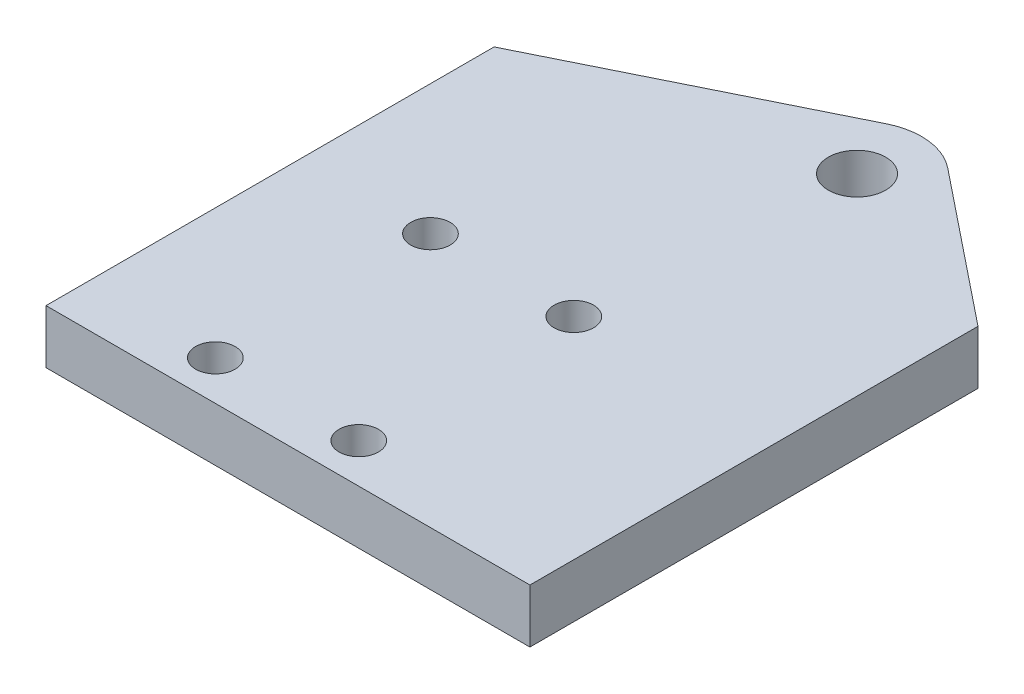
ISO-10303-21;
HEADER;
FILE_DESCRIPTION(('STEP AP214'),'2;1');
FILE_NAME('part.step','',(''),(''),'','','');
FILE_SCHEMA(('AUTOMOTIVE_DESIGN { 1 0 10303 214 1 1 1 1 }'));
ENDSEC;
DATA;
#1=APPLICATION_CONTEXT('core data for automotive mechanical design processes');
#2=APPLICATION_PROTOCOL_DEFINITION('international standard','automotive_design',2000,#1);
#3=PRODUCT_CONTEXT('',#1,'mechanical');
#4=PRODUCT('Part','Part','',(#3));
#5=PRODUCT_RELATED_PRODUCT_CATEGORY('part','',(#4));
#6=PRODUCT_DEFINITION_FORMATION('','',#4);
#7=PRODUCT_DEFINITION_CONTEXT('part definition',#1,'design');
#8=PRODUCT_DEFINITION('design','',#6,#7);
#9=PRODUCT_DEFINITION_SHAPE('','',#8);
#10=(LENGTH_UNIT() NAMED_UNIT(*) SI_UNIT(.MILLI.,.METRE.));
#11=(NAMED_UNIT(*) PLANE_ANGLE_UNIT() SI_UNIT($,.RADIAN.));
#12=(NAMED_UNIT(*) SI_UNIT($,.STERADIAN.) SOLID_ANGLE_UNIT());
#13=UNCERTAINTY_MEASURE_WITH_UNIT(LENGTH_MEASURE(1.E-05),#10,'distance_accuracy_value','');
#14=(GEOMETRIC_REPRESENTATION_CONTEXT(3) GLOBAL_UNCERTAINTY_ASSIGNED_CONTEXT((#13)) GLOBAL_UNIT_ASSIGNED_CONTEXT((#10,
#11,#12)) REPRESENTATION_CONTEXT('',''));
#15=CARTESIAN_POINT('',(0.,0.,0.));
#16=DIRECTION('',(0.,0.,1.));
#17=DIRECTION('',(1.,0.,0.));
#18=AXIS2_PLACEMENT_3D('',#15,#16,#17);
#19=CARTESIAN_POINT('',(16.25,0.,-29.));
#20=DIRECTION('',(0.,1.,0.));
#21=DIRECTION('',(0.,0.,1.));
#22=AXIS2_PLACEMENT_3D('',#19,#20,#21);
#23=PLANE('',#22);
#24=CARTESIAN_POINT('',(7.25,0.,-2.20000000000001));
#25=DIRECTION('',(0.,1.,0.));
#26=DIRECTION('',(0.,0.,-1.));
#27=AXIS2_PLACEMENT_3D('',#24,#25,#26);
#28=CIRCLE('',#27,1.1);
#29=CARTESIAN_POINT('',(7.25,0.,-3.30000000000001));
#30=VERTEX_POINT('',#29);
#31=EDGE_CURVE('E137',#30,#30,#28,.T.);
#32=ORIENTED_EDGE('',*,*,#31,.T.);
#33=EDGE_LOOP('',(#32));
#34=FACE_BOUND('',#33,.T.);
#35=CARTESIAN_POINT('',(15.25,0.,-2.2));
#36=DIRECTION('',(0.,1.,0.));
#37=DIRECTION('',(0.,0.,1.));
#38=AXIS2_PLACEMENT_3D('',#35,#36,#37);
#39=CIRCLE('',#38,1.1);
#40=CARTESIAN_POINT('',(15.25,0.,-1.1));
#41=VERTEX_POINT('',#40);
#42=EDGE_CURVE('E146',#41,#41,#39,.T.);
#43=ORIENTED_EDGE('',*,*,#42,.T.);
#44=EDGE_LOOP('',(#43));
#45=FACE_BOUND('',#44,.T.);
#46=CARTESIAN_POINT('',(15.25,0.,-14.2));
#47=DIRECTION('',(0.,1.,0.));
#48=DIRECTION('',(0.,0.,-1.));
#49=AXIS2_PLACEMENT_3D('',#46,#47,#48);
#50=CIRCLE('',#49,1.1);
#51=CARTESIAN_POINT('',(15.25,0.,-15.3));
#52=VERTEX_POINT('',#51);
#53=EDGE_CURVE('E152',#52,#52,#50,.T.);
#54=ORIENTED_EDGE('',*,*,#53,.T.);
#55=EDGE_LOOP('',(#54));
#56=FACE_BOUND('',#55,.T.);
#57=CARTESIAN_POINT('',(7.25,0.,-14.2));
#58=DIRECTION('',(0.,1.,0.));
#59=DIRECTION('',(0.,0.,1.));
#60=AXIS2_PLACEMENT_3D('',#57,#58,#59);
#61=CIRCLE('',#60,1.1);
#62=CARTESIAN_POINT('',(7.25,0.,-13.1));
#63=VERTEX_POINT('',#62);
#64=EDGE_CURVE('E158',#63,#63,#61,.T.);
#65=ORIENTED_EDGE('',*,*,#64,.T.);
#66=EDGE_LOOP('',(#65));
#67=FACE_BOUND('',#66,.T.);
#68=DIRECTION('',(0.,0.,1.));
#69=VECTOR('',#68,1.);
#70=CARTESIAN_POINT('',(19.7440573676193,0.,-18.));
#71=LINE('',#70,#69);
#72=CARTESIAN_POINT('',(19.7440573676193,0.,-30.8135033834861));
#73=VERTEX_POINT('',#72);
#74=CARTESIAN_POINT('',(19.7440573676193,0.,-18.));
#75=VERTEX_POINT('',#74);
#76=EDGE_CURVE('E131',#73,#75,#71,.T.);
#77=ORIENTED_EDGE('',*,*,#76,.F.);
#78=DIRECTION('',(-0.780409562277586,0.,-0.625268674335846));
#79=VECTOR('',#78,1.);
#80=CARTESIAN_POINT('',(27.,0.,-25.));
#81=LINE('',#80,#79);
#82=CARTESIAN_POINT('',(27.,0.,-25.));
#83=VERTEX_POINT('',#82);
#84=EDGE_CURVE('E188',#83,#73,#81,.T.);
#85=ORIENTED_EDGE('',*,*,#84,.F.);
#86=DIRECTION('',(0.,0.,-1.));
#87=VECTOR('',#86,1.);
#88=CARTESIAN_POINT('',(27.,0.,0.));
#89=LINE('',#88,#87);
#90=CARTESIAN_POINT('',(27.,0.,0.));
#91=VERTEX_POINT('',#90);
#92=EDGE_CURVE('E186',#91,#83,#89,.T.);
#93=ORIENTED_EDGE('',*,*,#92,.F.);
#94=DIRECTION('',(1.,0.,0.));
#95=VECTOR('',#94,1.);
#96=CARTESIAN_POINT('',(0.,0.,0.));
#97=LINE('',#96,#95);
#98=CARTESIAN_POINT('',(0.,0.,0.));
#99=VERTEX_POINT('',#98);
#100=EDGE_CURVE('E184',#99,#91,#97,.T.);
#101=ORIENTED_EDGE('',*,*,#100,.F.);
#102=DIRECTION('',(0.,0.,1.));
#103=VECTOR('',#102,1.);
#104=CARTESIAN_POINT('',(0.,0.,0.));
#105=LINE('',#104,#103);
#106=CARTESIAN_POINT('',(0.,0.,-25.));
#107=VERTEX_POINT('',#106);
#108=EDGE_CURVE('E164',#107,#99,#105,.T.);
#109=ORIENTED_EDGE('',*,*,#108,.F.);
#110=DIRECTION('',(-0.896864629431628,0.,0.442305139552401));
#111=VECTOR('',#110,1.);
#112=CARTESIAN_POINT('',(0.,0.,-25.));
#113=LINE('',#112,#111);
#114=CARTESIAN_POINT('',(1.74405736761932,0.,-25.8601136805463));
#115=VERTEX_POINT('',#114);
#116=EDGE_CURVE('E171',#115,#107,#113,.T.);
#117=ORIENTED_EDGE('',*,*,#116,.F.);
#118=DIRECTION('',(0.,0.,-1.));
#119=VECTOR('',#118,1.);
#120=CARTESIAN_POINT('',(1.74405736761932,0.,-25.8601136805463));
#121=LINE('',#120,#119);
#122=CARTESIAN_POINT('',(1.74405736761932,0.,-18.));
#123=VERTEX_POINT('',#122);
#124=EDGE_CURVE('E55',#123,#115,#121,.T.);
#125=ORIENTED_EDGE('',*,*,#124,.F.);
#126=DIRECTION('',(-1.,0.,0.));
#127=VECTOR('',#126,1.);
#128=CARTESIAN_POINT('',(1.74405736761932,0.,-18.));
#129=LINE('',#128,#127);
#130=EDGE_CURVE('E50',#75,#123,#129,.T.);
#131=ORIENTED_EDGE('',*,*,#130,.F.);
#132=EDGE_LOOP('',(#77,#85,#93,#101,#109,#117,#125,#131));
#133=FACE_BOUND('',#132,.T.);
#134=ADVANCED_FACE('F35',(#34,#45,#56,#67,#133),#23,.F.);
#135=CARTESIAN_POINT('',(16.25,3.,-29.));
#136=DIRECTION('',(0.,1.,0.));
#137=DIRECTION('',(0.,0.,1.));
#138=AXIS2_PLACEMENT_3D('',#135,#136,#137);
#139=PLANE('',#138);
#140=CARTESIAN_POINT('',(7.25,3.,-2.20000000000001));
#141=DIRECTION('',(0.,1.,0.));
#142=DIRECTION('',(0.,0.,-1.));
#143=AXIS2_PLACEMENT_3D('',#140,#141,#142);
#144=CIRCLE('',#143,1.1);
#145=CARTESIAN_POINT('',(7.25,3.,-3.30000000000001));
#146=VERTEX_POINT('',#145);
#147=EDGE_CURVE('E143',#146,#146,#144,.T.);
#148=ORIENTED_EDGE('',*,*,#147,.F.);
#149=EDGE_LOOP('',(#148));
#150=FACE_BOUND('',#149,.T.);
#151=CARTESIAN_POINT('',(15.25,3.,-14.2));
#152=DIRECTION('',(0.,1.,0.));
#153=DIRECTION('',(0.,0.,-1.));
#154=AXIS2_PLACEMENT_3D('',#151,#152,#153);
#155=CIRCLE('',#154,1.1);
#156=CARTESIAN_POINT('',(15.25,3.,-15.3));
#157=VERTEX_POINT('',#156);
#158=EDGE_CURVE('E155',#157,#157,#155,.T.);
#159=ORIENTED_EDGE('',*,*,#158,.F.);
#160=EDGE_LOOP('',(#159));
#161=FACE_BOUND('',#160,.T.);
#162=DIRECTION('',(0.,0.,1.));
#163=VECTOR('',#162,1.);
#164=CARTESIAN_POINT('',(0.,3.,0.));
#165=LINE('',#164,#163);
#166=CARTESIAN_POINT('',(0.,3.,-25.));
#167=VERTEX_POINT('',#166);
#168=CARTESIAN_POINT('',(0.,3.,0.));
#169=VERTEX_POINT('',#168);
#170=EDGE_CURVE('E167',#167,#169,#165,.T.);
#171=ORIENTED_EDGE('',*,*,#170,.T.);
#172=DIRECTION('',(1.,0.,0.));
#173=VECTOR('',#172,1.);
#174=CARTESIAN_POINT('',(0.,3.,0.));
#175=LINE('',#174,#173);
#176=CARTESIAN_POINT('',(27.,3.,0.));
#177=VERTEX_POINT('',#176);
#178=EDGE_CURVE('E170',#169,#177,#175,.T.);
#179=ORIENTED_EDGE('',*,*,#178,.T.);
#180=DIRECTION('',(0.,0.,-1.));
#181=VECTOR('',#180,1.);
#182=CARTESIAN_POINT('',(27.,3.,0.));
#183=LINE('',#182,#181);
#184=CARTESIAN_POINT('',(27.,3.,-25.));
#185=VERTEX_POINT('',#184);
#186=EDGE_CURVE('E173',#177,#185,#183,.T.);
#187=ORIENTED_EDGE('',*,*,#186,.T.);
#188=DIRECTION('',(-0.780409562277586,0.,-0.625268674335846));
#189=VECTOR('',#188,1.);
#190=CARTESIAN_POINT('',(27.,3.,-25.));
#191=LINE('',#190,#189);
#192=CARTESIAN_POINT('',(18.500967227609,3.,-31.8094744241993));
#193=VERTEX_POINT('',#192);
#194=EDGE_CURVE('E175',#185,#193,#191,.T.);
#195=ORIENTED_EDGE('',*,*,#194,.T.);
#196=CARTESIAN_POINT('',(16.25,3.,-29.));
#197=DIRECTION('',(0.,1.,0.));
#198=DIRECTION('',(0.,0.,1.));
#199=AXIS2_PLACEMENT_3D('',#196,#197,#198);
#200=CIRCLE('',#199,3.6);
#201=CARTESIAN_POINT('',(14.6577014976114,3.,-32.2287126659539));
#202=VERTEX_POINT('',#201);
#203=EDGE_CURVE('E177',#193,#202,#200,.T.);
#204=ORIENTED_EDGE('',*,*,#203,.T.);
#205=DIRECTION('',(-0.896864629431628,0.,0.442305139552401));
#206=VECTOR('',#205,1.);
#207=CARTESIAN_POINT('',(0.,3.,-25.));
#208=LINE('',#207,#206);
#209=EDGE_CURVE('E179',#202,#167,#208,.T.);
#210=ORIENTED_EDGE('',*,*,#209,.T.);
#211=EDGE_LOOP('',(#171,#179,#187,#195,#204,#210));
#212=FACE_BOUND('',#211,.T.);
#213=CARTESIAN_POINT('',(7.25,3.,-14.2));
#214=DIRECTION('',(0.,1.,0.));
#215=DIRECTION('',(0.,0.,1.));
#216=AXIS2_PLACEMENT_3D('',#213,#214,#215);
#217=CIRCLE('',#216,1.1);
#218=CARTESIAN_POINT('',(7.25,3.,-13.1));
#219=VERTEX_POINT('',#218);
#220=EDGE_CURVE('E161',#219,#219,#217,.T.);
#221=ORIENTED_EDGE('',*,*,#220,.F.);
#222=EDGE_LOOP('',(#221));
#223=FACE_BOUND('',#222,.T.);
#224=CARTESIAN_POINT('',(15.25,3.,-2.2));
#225=DIRECTION('',(0.,1.,0.));
#226=DIRECTION('',(0.,0.,1.));
#227=AXIS2_PLACEMENT_3D('',#224,#225,#226);
#228=CIRCLE('',#227,1.1);
#229=CARTESIAN_POINT('',(15.25,3.,-1.1));
#230=VERTEX_POINT('',#229);
#231=EDGE_CURVE('E149',#230,#230,#228,.T.);
#232=ORIENTED_EDGE('',*,*,#231,.F.);
#233=EDGE_LOOP('',(#232));
#234=FACE_BOUND('',#233,.T.);
#235=CARTESIAN_POINT('',(16.25,3.,-29.));
#236=DIRECTION('',(0.,1.,0.));
#237=DIRECTION('',(0.,0.,1.));
#238=AXIS2_PLACEMENT_3D('',#235,#236,#237);
#239=CIRCLE('',#238,1.6);
#240=CARTESIAN_POINT('',(16.25,3.,-27.4));
#241=VERTEX_POINT('',#240);
#242=EDGE_CURVE('E134',#241,#241,#239,.T.);
#243=ORIENTED_EDGE('',*,*,#242,.F.);
#244=EDGE_LOOP('',(#243));
#245=FACE_BOUND('',#244,.T.);
#246=ADVANCED_FACE('F248',(#150,#161,#212,#223,#234,#245),#139,.T.);
#247=CARTESIAN_POINT('',(0.,3.,0.));
#248=DIRECTION('',(1.,0.,0.));
#249=DIRECTION('',(0.,0.,-1.));
#250=AXIS2_PLACEMENT_3D('',#247,#248,#249);
#251=PLANE('',#250);
#252=ORIENTED_EDGE('',*,*,#108,.T.);
#253=DIRECTION('',(0.,-1.,0.));
#254=VECTOR('',#253,1.);
#255=CARTESIAN_POINT('',(0.,3.,0.));
#256=LINE('',#255,#254);
#257=EDGE_CURVE('E11',#169,#99,#256,.T.);
#258=ORIENTED_EDGE('',*,*,#257,.F.);
#259=ORIENTED_EDGE('',*,*,#170,.F.);
#260=DIRECTION('',(0.,-1.,0.));
#261=VECTOR('',#260,1.);
#262=CARTESIAN_POINT('',(0.,3.,-25.));
#263=LINE('',#262,#261);
#264=EDGE_CURVE('E181',#167,#107,#263,.T.);
#265=ORIENTED_EDGE('',*,*,#264,.T.);
#266=EDGE_LOOP('',(#252,#258,#259,#265));
#267=FACE_BOUND('',#266,.T.);
#268=ADVANCED_FACE('F37',(#267),#251,.F.);
#269=CARTESIAN_POINT('',(0.,3.,0.));
#270=DIRECTION('',(0.,0.,-1.));
#271=DIRECTION('',(-1.,0.,0.));
#272=AXIS2_PLACEMENT_3D('',#269,#270,#271);
#273=PLANE('',#272);
#274=ORIENTED_EDGE('',*,*,#100,.T.);
#275=DIRECTION('',(0.,-1.,0.));
#276=VECTOR('',#275,1.);
#277=CARTESIAN_POINT('',(27.,3.,0.));
#278=LINE('',#277,#276);
#279=EDGE_CURVE('E43',#177,#91,#278,.T.);
#280=ORIENTED_EDGE('',*,*,#279,.F.);
#281=ORIENTED_EDGE('',*,*,#178,.F.);
#282=ORIENTED_EDGE('',*,*,#257,.T.);
#283=EDGE_LOOP('',(#274,#280,#281,#282));
#284=FACE_BOUND('',#283,.T.);
#285=ADVANCED_FACE('F271',(#284),#273,.F.);
#286=CARTESIAN_POINT('',(27.,3.,0.));
#287=DIRECTION('',(-1.,0.,0.));
#288=DIRECTION('',(0.,0.,1.));
#289=AXIS2_PLACEMENT_3D('',#286,#287,#288);
#290=PLANE('',#289);
#291=ORIENTED_EDGE('',*,*,#92,.T.);
#292=DIRECTION('',(0.,-1.,0.));
#293=VECTOR('',#292,1.);
#294=CARTESIAN_POINT('',(27.,3.,-25.));
#295=LINE('',#294,#293);
#296=EDGE_CURVE('E198',#185,#83,#295,.T.);
#297=ORIENTED_EDGE('',*,*,#296,.F.);
#298=ORIENTED_EDGE('',*,*,#186,.F.);
#299=ORIENTED_EDGE('',*,*,#279,.T.);
#300=EDGE_LOOP('',(#291,#297,#298,#299));
#301=FACE_BOUND('',#300,.T.);
#302=ADVANCED_FACE('F205',(#301),#290,.F.);
#303=CARTESIAN_POINT('',(27.,3.,-25.));
#304=DIRECTION('',(-0.625268674335846,0.,0.780409562277586));
#305=DIRECTION('',(0.780409562277586,0.,0.625268674335846));
#306=AXIS2_PLACEMENT_3D('',#303,#304,#305);
#307=PLANE('',#306);
#308=ORIENTED_EDGE('',*,*,#84,.T.);
#309=DIRECTION('',(0.,1.,0.));
#310=VECTOR('',#309,1.);
#311=CARTESIAN_POINT('',(19.7440573676193,-3.,-30.8135033834861));
#312=LINE('',#311,#310);
#313=CARTESIAN_POINT('',(19.7440573676193,-3.,-30.8135033834861));
#314=VERTEX_POINT('',#313);
#315=EDGE_CURVE('E139',#314,#73,#312,.T.);
#316=ORIENTED_EDGE('',*,*,#315,.F.);
#317=DIRECTION('',(0.780409562277587,0.,0.625268674335845));
#318=VECTOR('',#317,1.);
#319=CARTESIAN_POINT('',(19.7440573676193,-3.,-30.8135033834861));
#320=LINE('',#319,#318);
#321=CARTESIAN_POINT('',(18.500967227609,-3.,-31.8094744241993));
#322=VERTEX_POINT('',#321);
#323=EDGE_CURVE('E226',#322,#314,#320,.T.);
#324=ORIENTED_EDGE('',*,*,#323,.F.);
#325=DIRECTION('',(0.,-1.,0.));
#326=VECTOR('',#325,1.);
#327=CARTESIAN_POINT('',(18.500967227609,3.,-31.8094744241993));
#328=LINE('',#327,#326);
#329=EDGE_CURVE('E196',#193,#322,#328,.T.);
#330=ORIENTED_EDGE('',*,*,#329,.F.);
#331=ORIENTED_EDGE('',*,*,#194,.F.);
#332=ORIENTED_EDGE('',*,*,#296,.T.);
#333=EDGE_LOOP('',(#308,#316,#324,#330,#331,#332));
#334=FACE_BOUND('',#333,.T.);
#335=ADVANCED_FACE('F213',(#334),#307,.F.);
#336=CARTESIAN_POINT('',(16.25,3.,-29.));
#337=DIRECTION('',(0.,-1.,0.));
#338=DIRECTION('',(0.,0.,-1.));
#339=AXIS2_PLACEMENT_3D('',#336,#337,#338);
#340=CYLINDRICAL_SURFACE('',#339,3.6);
#341=ORIENTED_EDGE('',*,*,#329,.T.);
#342=CARTESIAN_POINT('',(16.25,-3.,-29.));
#343=DIRECTION('',(0.,-1.,0.));
#344=DIRECTION('',(0.,0.,-1.));
#345=AXIS2_PLACEMENT_3D('',#342,#343,#344);
#346=CIRCLE('',#345,3.6);
#347=CARTESIAN_POINT('',(14.6577014976114,-3.,-32.2287126659539));
#348=VERTEX_POINT('',#347);
#349=EDGE_CURVE('E228',#348,#322,#346,.T.);
#350=ORIENTED_EDGE('',*,*,#349,.F.);
#351=DIRECTION('',(0.,-1.,0.));
#352=VECTOR('',#351,1.);
#353=CARTESIAN_POINT('',(14.6577014976114,3.,-32.2287126659539));
#354=LINE('',#353,#352);
#355=EDGE_CURVE('E194',#202,#348,#354,.T.);
#356=ORIENTED_EDGE('',*,*,#355,.F.);
#357=ORIENTED_EDGE('',*,*,#203,.F.);
#358=EDGE_LOOP('',(#341,#350,#356,#357));
#359=FACE_BOUND('',#358,.T.);
#360=ADVANCED_FACE('F263',(#359),#340,.T.);
#361=CARTESIAN_POINT('',(0.,3.,-25.));
#362=DIRECTION('',(0.442305139552401,0.,0.896864629431628));
#363=DIRECTION('',(0.896864629431628,0.,-0.442305139552401));
#364=AXIS2_PLACEMENT_3D('',#361,#362,#363);
#365=PLANE('',#364);
#366=ORIENTED_EDGE('',*,*,#355,.T.);
#367=DIRECTION('',(0.896864629431628,0.,-0.442305139552401));
#368=VECTOR('',#367,1.);
#369=CARTESIAN_POINT('',(14.6577014976114,-3.,-32.2287126659539));
#370=LINE('',#369,#368);
#371=CARTESIAN_POINT('',(1.74405736761932,-3.,-25.8601136805463));
#372=VERTEX_POINT('',#371);
#373=EDGE_CURVE('E120',#372,#348,#370,.T.);
#374=ORIENTED_EDGE('',*,*,#373,.F.);
#375=DIRECTION('',(0.,1.,0.));
#376=VECTOR('',#375,1.);
#377=CARTESIAN_POINT('',(1.74405736761932,-3.,-25.8601136805463));
#378=LINE('',#377,#376);
#379=EDGE_CURVE('E116',#372,#115,#378,.T.);
#380=ORIENTED_EDGE('',*,*,#379,.T.);
#381=ORIENTED_EDGE('',*,*,#116,.T.);
#382=ORIENTED_EDGE('',*,*,#264,.F.);
#383=ORIENTED_EDGE('',*,*,#209,.F.);
#384=EDGE_LOOP('',(#366,#374,#380,#381,#382,#383));
#385=FACE_BOUND('',#384,.T.);
#386=ADVANCED_FACE('F259',(#385),#365,.F.);
#387=CARTESIAN_POINT('',(7.25,3.,-14.2));
#388=DIRECTION('',(0.,-1.,0.));
#389=DIRECTION('',(0.,0.,-1.));
#390=AXIS2_PLACEMENT_3D('',#387,#388,#389);
#391=CYLINDRICAL_SURFACE('',#390,1.1);
#392=ORIENTED_EDGE('',*,*,#220,.T.);
#393=EDGE_LOOP('',(#392));
#394=FACE_BOUND('',#393,.T.);
#395=ORIENTED_EDGE('',*,*,#64,.F.);
#396=EDGE_LOOP('',(#395));
#397=FACE_BOUND('',#396,.T.);
#398=ADVANCED_FACE('F262',(#394,#397),#391,.F.);
#399=CARTESIAN_POINT('',(15.25,3.,-14.2));
#400=DIRECTION('',(0.,-1.,0.));
#401=DIRECTION('',(0.,0.,-1.));
#402=AXIS2_PLACEMENT_3D('',#399,#400,#401);
#403=CYLINDRICAL_SURFACE('',#402,1.1);
#404=ORIENTED_EDGE('',*,*,#158,.T.);
#405=EDGE_LOOP('',(#404));
#406=FACE_BOUND('',#405,.T.);
#407=ORIENTED_EDGE('',*,*,#53,.F.);
#408=EDGE_LOOP('',(#407));
#409=FACE_BOUND('',#408,.T.);
#410=ADVANCED_FACE('F296',(#406,#409),#403,.F.);
#411=CARTESIAN_POINT('',(15.25,3.,-2.2));
#412=DIRECTION('',(0.,-1.,0.));
#413=DIRECTION('',(0.,0.,-1.));
#414=AXIS2_PLACEMENT_3D('',#411,#412,#413);
#415=CYLINDRICAL_SURFACE('',#414,1.1);
#416=ORIENTED_EDGE('',*,*,#231,.T.);
#417=EDGE_LOOP('',(#416));
#418=FACE_BOUND('',#417,.T.);
#419=ORIENTED_EDGE('',*,*,#42,.F.);
#420=EDGE_LOOP('',(#419));
#421=FACE_BOUND('',#420,.T.);
#422=ADVANCED_FACE('F293',(#418,#421),#415,.F.);
#423=CARTESIAN_POINT('',(7.25,3.,-2.20000000000001));
#424=DIRECTION('',(0.,-1.,0.));
#425=DIRECTION('',(0.,0.,-1.));
#426=AXIS2_PLACEMENT_3D('',#423,#424,#425);
#427=CYLINDRICAL_SURFACE('',#426,1.1);
#428=ORIENTED_EDGE('',*,*,#147,.T.);
#429=EDGE_LOOP('',(#428));
#430=FACE_BOUND('',#429,.T.);
#431=ORIENTED_EDGE('',*,*,#31,.F.);
#432=EDGE_LOOP('',(#431));
#433=FACE_BOUND('',#432,.T.);
#434=ADVANCED_FACE('F243',(#430,#433),#427,.F.);
#435=CARTESIAN_POINT('',(16.25,3.,-29.));
#436=DIRECTION('',(0.,-1.,0.));
#437=DIRECTION('',(0.,0.,-1.));
#438=AXIS2_PLACEMENT_3D('',#435,#436,#437);
#439=CYLINDRICAL_SURFACE('',#438,1.6);
#440=ORIENTED_EDGE('',*,*,#242,.T.);
#441=EDGE_LOOP('',(#440));
#442=FACE_BOUND('',#441,.T.);
#443=CARTESIAN_POINT('',(16.25,-3.,-29.));
#444=DIRECTION('',(0.,-1.,0.));
#445=DIRECTION('',(0.,0.,-1.));
#446=AXIS2_PLACEMENT_3D('',#443,#444,#445);
#447=CIRCLE('',#446,1.6);
#448=CARTESIAN_POINT('',(16.25,-3.,-30.6));
#449=VERTEX_POINT('',#448);
#450=EDGE_CURVE('E224',#449,#449,#447,.T.);
#451=ORIENTED_EDGE('',*,*,#450,.T.);
#452=EDGE_LOOP('',(#451));
#453=FACE_BOUND('',#452,.T.);
#454=ADVANCED_FACE('F235',(#442,#453),#439,.F.);
#455=CARTESIAN_POINT('',(16.25,-3.,-29.));
#456=DIRECTION('',(0.,-1.,0.));
#457=DIRECTION('',(0.,0.,-1.));
#458=AXIS2_PLACEMENT_3D('',#455,#456,#457);
#459=PLANE('',#458);
#460=DIRECTION('',(-1.,0.,0.));
#461=VECTOR('',#460,1.);
#462=CARTESIAN_POINT('',(1.74405736761932,-3.,-18.));
#463=LINE('',#462,#461);
#464=CARTESIAN_POINT('',(19.7440573676193,-3.,-18.));
#465=VERTEX_POINT('',#464);
#466=CARTESIAN_POINT('',(1.74405736761932,-3.,-18.));
#467=VERTEX_POINT('',#466);
#468=EDGE_CURVE('E121',#465,#467,#463,.T.);
#469=ORIENTED_EDGE('',*,*,#468,.T.);
#470=DIRECTION('',(0.,0.,-1.));
#471=VECTOR('',#470,1.);
#472=CARTESIAN_POINT('',(1.74405736761932,-3.,-25.8601136805463));
#473=LINE('',#472,#471);
#474=EDGE_CURVE('E110',#467,#372,#473,.T.);
#475=ORIENTED_EDGE('',*,*,#474,.T.);
#476=ORIENTED_EDGE('',*,*,#373,.T.);
#477=ORIENTED_EDGE('',*,*,#349,.T.);
#478=ORIENTED_EDGE('',*,*,#323,.T.);
#479=DIRECTION('',(0.,0.,1.));
#480=VECTOR('',#479,1.);
#481=CARTESIAN_POINT('',(19.7440573676193,-3.,-18.));
#482=LINE('',#481,#480);
#483=EDGE_CURVE('E127',#314,#465,#482,.T.);
#484=ORIENTED_EDGE('',*,*,#483,.T.);
#485=EDGE_LOOP('',(#469,#475,#476,#477,#478,#484));
#486=FACE_BOUND('',#485,.T.);
#487=ORIENTED_EDGE('',*,*,#450,.F.);
#488=EDGE_LOOP('',(#487));
#489=FACE_BOUND('',#488,.T.);
#490=ADVANCED_FACE('F124',(#486,#489),#459,.T.);
#491=CARTESIAN_POINT('',(1.74405736761932,-3.,-18.));
#492=DIRECTION('',(0.,0.,-1.));
#493=DIRECTION('',(-1.,0.,0.));
#494=AXIS2_PLACEMENT_3D('',#491,#492,#493);
#495=PLANE('',#494);
#496=ORIENTED_EDGE('',*,*,#130,.T.);
#497=DIRECTION('',(0.,1.,0.));
#498=VECTOR('',#497,1.);
#499=CARTESIAN_POINT('',(1.74405736761932,-3.,-18.));
#500=LINE('',#499,#498);
#501=EDGE_CURVE('E114',#467,#123,#500,.T.);
#502=ORIENTED_EDGE('',*,*,#501,.F.);
#503=ORIENTED_EDGE('',*,*,#468,.F.);
#504=DIRECTION('',(0.,1.,0.));
#505=VECTOR('',#504,1.);
#506=CARTESIAN_POINT('',(19.7440573676193,-3.,-18.));
#507=LINE('',#506,#505);
#508=EDGE_CURVE('E218',#465,#75,#507,.T.);
#509=ORIENTED_EDGE('',*,*,#508,.T.);
#510=EDGE_LOOP('',(#496,#502,#503,#509));
#511=FACE_BOUND('',#510,.T.);
#512=ADVANCED_FACE('F133',(#511),#495,.F.);
#513=CARTESIAN_POINT('',(1.74405736761932,-3.,-25.8601136805463));
#514=DIRECTION('',(1.,0.,0.));
#515=DIRECTION('',(0.,0.,-1.));
#516=AXIS2_PLACEMENT_3D('',#513,#514,#515);
#517=PLANE('',#516);
#518=ORIENTED_EDGE('',*,*,#124,.T.);
#519=ORIENTED_EDGE('',*,*,#379,.F.);
#520=ORIENTED_EDGE('',*,*,#474,.F.);
#521=ORIENTED_EDGE('',*,*,#501,.T.);
#522=EDGE_LOOP('',(#518,#519,#520,#521));
#523=FACE_BOUND('',#522,.T.);
#524=ADVANCED_FACE('F112',(#523),#517,.F.);
#525=CARTESIAN_POINT('',(19.7440573676193,-3.,-18.));
#526=DIRECTION('',(-1.,0.,0.));
#527=DIRECTION('',(0.,0.,1.));
#528=AXIS2_PLACEMENT_3D('',#525,#526,#527);
#529=PLANE('',#528);
#530=ORIENTED_EDGE('',*,*,#76,.T.);
#531=ORIENTED_EDGE('',*,*,#508,.F.);
#532=ORIENTED_EDGE('',*,*,#483,.F.);
#533=ORIENTED_EDGE('',*,*,#315,.T.);
#534=EDGE_LOOP('',(#530,#531,#532,#533));
#535=FACE_BOUND('',#534,.T.);
#536=ADVANCED_FACE('F217',(#535),#529,.F.);
#537=CLOSED_SHELL('',(#134,#246,#268,#285,#302,#335,#360,#386,#398,#410,#422,#434,#454,#490,
#512,#524,#536));
#538=MANIFOLD_SOLID_BREP('B2',#537);
#539=ADVANCED_BREP_SHAPE_REPRESENTATION('',(#18,#538),#14);
#540=SHAPE_DEFINITION_REPRESENTATION(#9,#539);
ENDSEC;
END-ISO-10303-21;
